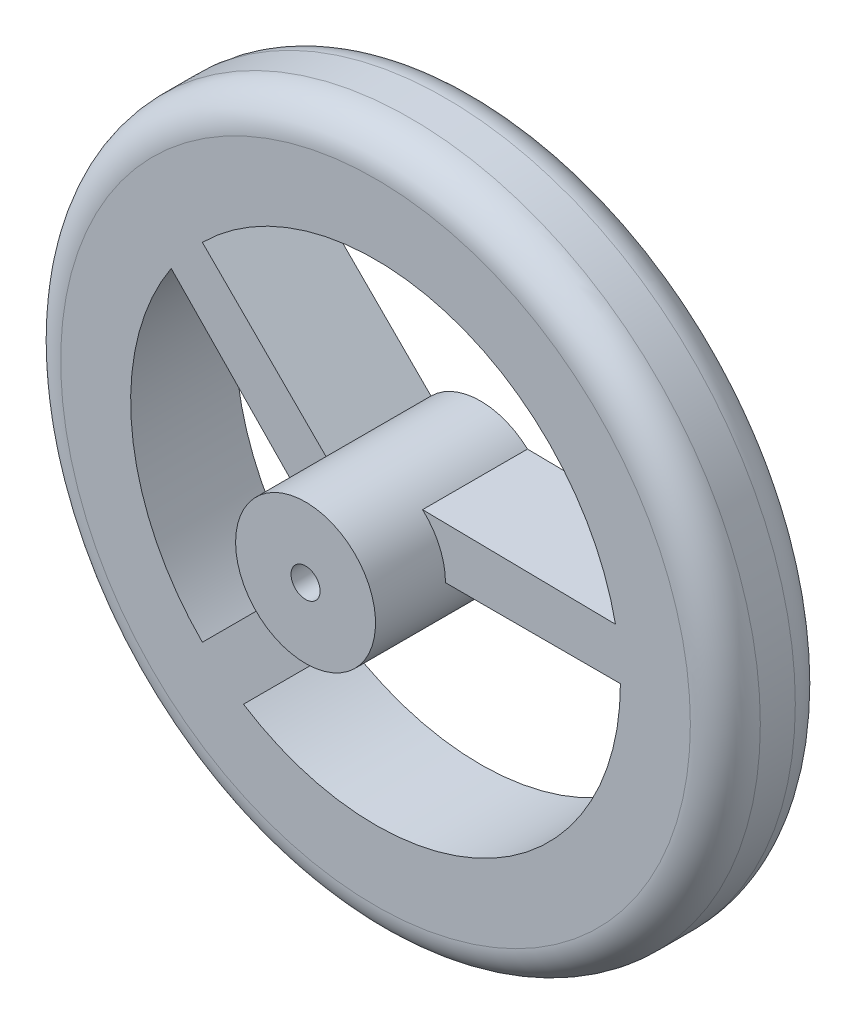
ISO-10303-21;
HEADER;
FILE_DESCRIPTION(('STEP AP214'),'2;1');
FILE_NAME('part.step','',(''),(''),'','','');
FILE_SCHEMA(('AUTOMOTIVE_DESIGN { 1 0 10303 214 1 1 1 1 }'));
ENDSEC;
DATA;
#1=APPLICATION_CONTEXT('core data for automotive mechanical design processes');
#2=APPLICATION_PROTOCOL_DEFINITION('international standard','automotive_design',2000,#1);
#3=PRODUCT_CONTEXT('',#1,'mechanical');
#4=PRODUCT('Part','Part','',(#3));
#5=PRODUCT_RELATED_PRODUCT_CATEGORY('part','',(#4));
#6=PRODUCT_DEFINITION_FORMATION('','',#4);
#7=PRODUCT_DEFINITION_CONTEXT('part definition',#1,'design');
#8=PRODUCT_DEFINITION('design','',#6,#7);
#9=PRODUCT_DEFINITION_SHAPE('','',#8);
#10=(LENGTH_UNIT() NAMED_UNIT(*) SI_UNIT(.MILLI.,.METRE.));
#11=(NAMED_UNIT(*) PLANE_ANGLE_UNIT() SI_UNIT($,.RADIAN.));
#12=(NAMED_UNIT(*) SI_UNIT($,.STERADIAN.) SOLID_ANGLE_UNIT());
#13=UNCERTAINTY_MEASURE_WITH_UNIT(LENGTH_MEASURE(1.E-05),#10,'distance_accuracy_value','');
#14=(GEOMETRIC_REPRESENTATION_CONTEXT(3) GLOBAL_UNCERTAINTY_ASSIGNED_CONTEXT((#13)) GLOBAL_UNIT_ASSIGNED_CONTEXT((#10,
#11,#12)) REPRESENTATION_CONTEXT('',''));
#15=CARTESIAN_POINT('',(0.,0.,0.));
#16=DIRECTION('',(0.,0.,1.));
#17=DIRECTION('',(1.,0.,0.));
#18=AXIS2_PLACEMENT_3D('',#15,#16,#17);
#19=CARTESIAN_POINT('',(-3.73474608254156,-3.26718277560812,20.2211248539088));
#20=DIRECTION('',(-0.71734036356114,-0.696722902455468,0.));
#21=DIRECTION('',(0.696722902455468,-0.71734036356114,0.));
#22=AXIS2_PLACEMENT_3D('',#19,#20,#21);
#23=PLANE('',#22);
#24=DIRECTION('',(0.,0.,-1.));
#25=VECTOR('',#24,1.);
#26=CARTESIAN_POINT('',(-6.50015714980125,-0.419937517281248,26.2211248539088));
#27=LINE('',#26,#25);
#28=CARTESIAN_POINT('',(-6.50015714980125,-0.419937517281248,20.2211248539088));
#29=VERTEX_POINT('',#28);
#30=CARTESIAN_POINT('',(-6.50015714980125,-0.419937517281248,11.2211248539088));
#31=VERTEX_POINT('',#30);
#32=EDGE_CURVE('E67',#29,#31,#27,.T.);
#33=ORIENTED_EDGE('',*,*,#32,.F.);
#34=DIRECTION('',(-0.696722902455468,0.71734036356114,0.));
#35=VECTOR('',#34,1.);
#36=CARTESIAN_POINT('',(-3.73474608254156,-3.26718277560812,20.2211248539088));
#37=LINE('',#36,#35);
#38=CARTESIAN_POINT('',(-18.0261327719899,11.4471153872213,20.2211248539088));
#39=VERTEX_POINT('',#38);
#40=EDGE_CURVE('E204',#29,#39,#37,.T.);
#41=ORIENTED_EDGE('',*,*,#40,.T.);
#42=DIRECTION('',(0.,0.,-1.));
#43=VECTOR('',#42,1.);
#44=CARTESIAN_POINT('',(-18.0261327719899,11.4471153872213,20.2211248539088));
#45=LINE('',#44,#43);
#46=CARTESIAN_POINT('',(-18.0261327719899,11.4471153872213,11.2211248539088));
#47=VERTEX_POINT('',#46);
#48=EDGE_CURVE('E386',#39,#47,#45,.T.);
#49=ORIENTED_EDGE('',*,*,#48,.T.);
#50=DIRECTION('',(-0.696722902455468,0.71734036356114,0.));
#51=VECTOR('',#50,1.);
#52=CARTESIAN_POINT('',(-3.73474608254156,-3.26718277560812,11.2211248539088));
#53=LINE('',#52,#51);
#54=EDGE_CURVE('E233',#31,#47,#53,.T.);
#55=ORIENTED_EDGE('',*,*,#54,.F.);
#56=EDGE_LOOP('',(#33,#41,#49,#55));
#57=FACE_BOUND('',#56,.T.);
#58=ADVANCED_FACE('F40',(#57),#23,.T.);
#59=CARTESIAN_POINT('',(-0.507057507427755,-0.132262915373639,20.2211248539088));
#60=DIRECTION('',(0.707106781186547,-0.707106781186547,0.));
#61=DIRECTION('',(0.707106781186548,0.707106781186548,0.));
#62=AXIS2_PLACEMENT_3D('',#59,#60,#61);
#63=PLANE('',#62);
#64=DIRECTION('',(-0.707106781186548,-0.707106781186548,0.));
#65=VECTOR('',#64,1.);
#66=CARTESIAN_POINT('',(-0.507057507427755,-0.132262915373639,20.2211248539088));
#67=LINE('',#66,#65);
#68=CARTESIAN_POINT('',(-4.74969819454704,-4.37490360249292,20.2211248539088));
#69=VERTEX_POINT('',#68);
#70=CARTESIAN_POINT('',(-15.3561895947211,-14.9813950026669,20.2211248539088));
#71=VERTEX_POINT('',#70);
#72=EDGE_CURVE('E44',#69,#71,#67,.T.);
#73=ORIENTED_EDGE('',*,*,#72,.F.);
#74=DIRECTION('',(0.,0.,-1.));
#75=VECTOR('',#74,1.);
#76=CARTESIAN_POINT('',(-4.74969819454704,-4.37490360249292,26.2211248539088));
#77=LINE('',#76,#75);
#78=CARTESIAN_POINT('',(-4.74969819454704,-4.37490360249292,11.2211248539088));
#79=VERTEX_POINT('',#78);
#80=EDGE_CURVE('E152',#69,#79,#77,.T.);
#81=ORIENTED_EDGE('',*,*,#80,.T.);
#82=DIRECTION('',(-0.707106781186548,-0.707106781186548,0.));
#83=VECTOR('',#82,1.);
#84=CARTESIAN_POINT('',(-0.507057507427755,-0.132262915373639,11.2211248539088));
#85=LINE('',#84,#83);
#86=CARTESIAN_POINT('',(-15.3561895947211,-14.9813950026669,11.2211248539088));
#87=VERTEX_POINT('',#86);
#88=EDGE_CURVE('E236',#79,#87,#85,.T.);
#89=ORIENTED_EDGE('',*,*,#88,.T.);
#90=CARTESIAN_POINT('',(-15.3562999123453,-14.9815053202911,20.2211248539088));
#91=DIRECTION('',(0.,0.,-1.));
#92=VECTOR('',#91,1.);
#93=LINE('',#90,#92);
#94=EDGE_CURVE('E253',#71,#87,#93,.T.);
#95=ORIENTED_EDGE('',*,*,#94,.F.);
#96=EDGE_LOOP('',(#73,#81,#89,#95));
#97=FACE_BOUND('',#96,.T.);
#98=ADVANCED_FACE('F260',(#97),#63,.F.);
#99=CARTESIAN_POINT('',(2.67492300791173,-3.31424343071308,20.2211248539088));
#100=DIRECTION('',(0.707106781186552,-0.707106781186543,0.));
#101=DIRECTION('',(0.707106781186543,0.707106781186552,0.));
#102=AXIS2_PLACEMENT_3D('',#99,#100,#101);
#103=PLANE('',#102);
#104=DIRECTION('',(0.,0.,-1.));
#105=VECTOR('',#104,1.);
#106=CARTESIAN_POINT('',(-0.131320032168712,-6.12048647079356,26.2211248539088));
#107=LINE('',#106,#105);
#108=CARTESIAN_POINT('',(-0.131320032168712,-6.12048647079356,20.2211248539088));
#109=VERTEX_POINT('',#108);
#110=CARTESIAN_POINT('',(-0.131320032168712,-6.12048647079356,11.2211248539088));
#111=VERTEX_POINT('',#110);
#112=EDGE_CURVE('E145',#109,#111,#107,.T.);
#113=ORIENTED_EDGE('',*,*,#112,.F.);
#114=DIRECTION('',(-0.707106781186543,-0.707106781186552,0.));
#115=VECTOR('',#114,1.);
#116=CARTESIAN_POINT('',(2.67492300791173,-3.31424343071308,20.2211248539088));
#117=LINE('',#116,#115);
#118=CARTESIAN_POINT('',(-11.8293866964485,-17.8185531350735,20.2211248539088));
#119=VERTEX_POINT('',#118);
#120=EDGE_CURVE('E131',#109,#119,#117,.T.);
#121=ORIENTED_EDGE('',*,*,#120,.T.);
#122=DIRECTION('',(0.,0.,-1.));
#123=VECTOR('',#122,1.);
#124=CARTESIAN_POINT('',(-11.8293866964485,-17.8185531350735,20.2211248539088));
#125=LINE('',#124,#123);
#126=CARTESIAN_POINT('',(-11.8293866964485,-17.8185531350735,11.2211248539088));
#127=VERTEX_POINT('',#126);
#128=EDGE_CURVE('E367',#119,#127,#125,.T.);
#129=ORIENTED_EDGE('',*,*,#128,.T.);
#130=DIRECTION('',(-0.707106781186543,-0.707106781186552,0.));
#131=VECTOR('',#130,1.);
#132=CARTESIAN_POINT('',(2.67492300791173,-3.31424343071308,11.2211248539088));
#133=LINE('',#132,#131);
#134=EDGE_CURVE('E147',#111,#127,#133,.T.);
#135=ORIENTED_EDGE('',*,*,#134,.F.);
#136=EDGE_LOOP('',(#113,#121,#129,#135));
#137=FACE_BOUND('',#136,.T.);
#138=ADVANCED_FACE('F146',(#137),#103,.T.);
#139=CARTESIAN_POINT('',(-0.507057507427755,-0.132262915373639,20.2211248539088));
#140=DIRECTION('',(0.,1.,0.));
#141=DIRECTION('',(0.,0.,1.));
#142=AXIS2_PLACEMENT_3D('',#139,#140,#141);
#143=PLANE('',#142);
#144=DIRECTION('',(1.,0.,0.));
#145=VECTOR('',#144,1.);
#146=CARTESIAN_POINT('',(-0.507057507427755,-0.132262915373639,20.2211248539088));
#147=LINE('',#146,#145);
#148=CARTESIAN_POINT('',(5.49294249257225,-0.132262915373639,20.2211248539088));
#149=VERTEX_POINT('',#148);
#150=CARTESIAN_POINT('',(20.4929424925722,-0.132262915373639,20.2211248539088));
#151=VERTEX_POINT('',#150);
#152=EDGE_CURVE('E141',#149,#151,#147,.T.);
#153=ORIENTED_EDGE('',*,*,#152,.F.);
#154=DIRECTION('',(0.,0.,-1.));
#155=VECTOR('',#154,1.);
#156=CARTESIAN_POINT('',(5.49294249257225,-0.132262915373639,26.2211248539088));
#157=LINE('',#156,#155);
#158=CARTESIAN_POINT('',(5.49294249257225,-0.132262915373639,11.2211248539088));
#159=VERTEX_POINT('',#158);
#160=EDGE_CURVE('E186',#149,#159,#157,.T.);
#161=ORIENTED_EDGE('',*,*,#160,.T.);
#162=DIRECTION('',(1.,0.,0.));
#163=VECTOR('',#162,1.);
#164=CARTESIAN_POINT('',(-0.507057507427755,-0.132262915373639,11.2211248539088));
#165=LINE('',#164,#163);
#166=CARTESIAN_POINT('',(20.4929424925722,-0.132262915373639,11.2211248539088));
#167=VERTEX_POINT('',#166);
#168=EDGE_CURVE('E226',#159,#167,#165,.T.);
#169=ORIENTED_EDGE('',*,*,#168,.T.);
#170=DIRECTION('',(0.,0.,-1.));
#171=VECTOR('',#170,1.);
#172=CARTESIAN_POINT('',(20.4929424925722,-0.132262915373639,20.2211248539088));
#173=LINE('',#172,#171);
#174=EDGE_CURVE('E356',#151,#167,#173,.T.);
#175=ORIENTED_EDGE('',*,*,#174,.F.);
#176=EDGE_LOOP('',(#153,#161,#169,#175));
#177=FACE_BOUND('',#176,.T.);
#178=ADVANCED_FACE('F280',(#177),#143,.F.);
#179=CARTESIAN_POINT('',(-0.441460120054603,4.36678065529586,20.2211248539088));
#180=DIRECTION('',(0.0145787465586759,0.99989372442714,0.));
#181=DIRECTION('',(-0.99989372442714,0.0145787465586759,0.));
#182=AXIS2_PLACEMENT_3D('',#179,#180,#181);
#183=PLANE('',#182);
#184=DIRECTION('',(0.,0.,-1.));
#185=VECTOR('',#184,1.);
#186=CARTESIAN_POINT('',(3.52728722823723,4.30891514385932,26.2211248539088));
#187=LINE('',#186,#185);
#188=CARTESIAN_POINT('',(3.52728722823723,4.30891514385932,20.2211248539088));
#189=VERTEX_POINT('',#188);
#190=CARTESIAN_POINT('',(3.52728722823723,4.30891514385932,11.2211248539088));
#191=VERTEX_POINT('',#190);
#192=EDGE_CURVE('E169',#189,#191,#187,.T.);
#193=ORIENTED_EDGE('',*,*,#192,.F.);
#194=DIRECTION('',(0.99989372442714,-0.0145787465586759,0.));
#195=VECTOR('',#194,1.);
#196=CARTESIAN_POINT('',(-0.441460120054603,4.36678065529586,20.2211248539088));
#197=LINE('',#196,#195);
#198=CARTESIAN_POINT('',(20.0686563319509,4.06773708462636,20.2211248539088));
#199=VERTEX_POINT('',#198);
#200=EDGE_CURVE('E190',#189,#199,#197,.T.);
#201=ORIENTED_EDGE('',*,*,#200,.T.);
#202=DIRECTION('',(0.,0.,-1.));
#203=VECTOR('',#202,1.);
#204=CARTESIAN_POINT('',(20.0686563319509,4.06773708462636,20.2211248539088));
#205=LINE('',#204,#203);
#206=CARTESIAN_POINT('',(20.0686563319509,4.06773708462636,11.2211248539088));
#207=VERTEX_POINT('',#206);
#208=EDGE_CURVE('E212',#199,#207,#205,.T.);
#209=ORIENTED_EDGE('',*,*,#208,.T.);
#210=DIRECTION('',(0.99989372442714,-0.0145787465586759,0.));
#211=VECTOR('',#210,1.);
#212=CARTESIAN_POINT('',(-0.441460120054603,4.36678065529586,11.2211248539088));
#213=LINE('',#212,#211);
#214=EDGE_CURVE('E189',#191,#207,#213,.T.);
#215=ORIENTED_EDGE('',*,*,#214,.F.);
#216=EDGE_LOOP('',(#193,#201,#209,#215));
#217=FACE_BOUND('',#216,.T.);
#218=ADVANCED_FACE('F283',(#217),#183,.T.);
#219=CARTESIAN_POINT('',(-0.507057507427755,-0.132262915373639,20.2211248539088));
#220=DIRECTION('',(-0.707106781186544,-0.707106781186551,0.));
#221=DIRECTION('',(0.707106781186551,-0.707106781186544,0.));
#222=AXIS2_PLACEMENT_3D('',#219,#220,#221);
#223=PLANE('',#222);
#224=DIRECTION('',(-0.707106781186551,0.707106781186544,0.));
#225=VECTOR('',#224,1.);
#226=CARTESIAN_POINT('',(-0.507057507427755,-0.132262915373639,20.2211248539088));
#227=LINE('',#226,#225);
#228=CARTESIAN_POINT('',(-4.74969819454706,4.11037777174562,20.2211248539088));
#229=VERTEX_POINT('',#228);
#230=CARTESIAN_POINT('',(-15.3562999123453,14.7169794895438,20.2211248539088));
#231=VERTEX_POINT('',#230);
#232=EDGE_CURVE('E193',#229,#231,#227,.T.);
#233=ORIENTED_EDGE('',*,*,#232,.F.);
#234=DIRECTION('',(0.,0.,-1.));
#235=VECTOR('',#234,1.);
#236=CARTESIAN_POINT('',(-4.74969819454706,4.11037777174562,26.2211248539088));
#237=LINE('',#236,#235);
#238=CARTESIAN_POINT('',(-4.74969819454706,4.11037777174562,11.2211248539088));
#239=VERTEX_POINT('',#238);
#240=EDGE_CURVE('E172',#229,#239,#237,.T.);
#241=ORIENTED_EDGE('',*,*,#240,.T.);
#242=DIRECTION('',(-0.707106781186551,0.707106781186544,0.));
#243=VECTOR('',#242,1.);
#244=CARTESIAN_POINT('',(-0.507057507427755,-0.132262915373639,11.2211248539088));
#245=LINE('',#244,#243);
#246=CARTESIAN_POINT('',(-15.3562999123453,14.7169794895438,11.2211248539088));
#247=VERTEX_POINT('',#246);
#248=EDGE_CURVE('E217',#239,#247,#245,.T.);
#249=ORIENTED_EDGE('',*,*,#248,.T.);
#250=DIRECTION('',(0.,0.,-1.));
#251=VECTOR('',#250,1.);
#252=CARTESIAN_POINT('',(-15.3562999123453,14.7169794895438,20.2211248539088));
#253=LINE('',#252,#251);
#254=EDGE_CURVE('E364',#231,#247,#253,.T.);
#255=ORIENTED_EDGE('',*,*,#254,.F.);
#256=EDGE_LOOP('',(#233,#241,#249,#255));
#257=FACE_BOUND('',#256,.T.);
#258=ADVANCED_FACE('F291',(#257),#223,.F.);
#259=CARTESIAN_POINT('',(-0.507057507427755,-0.132262915373639,20.2211248539088));
#260=DIRECTION('',(0.,0.,-1.));
#261=DIRECTION('',(-1.,0.,0.));
#262=AXIS2_PLACEMENT_3D('',#259,#260,#261);
#263=CYLINDRICAL_SURFACE('',#262,21.);
#264=CARTESIAN_POINT('',(-0.507057507427755,-0.132262915373639,11.2211248539088));
#265=DIRECTION('',(0.,0.,1.));
#266=DIRECTION('',(1.,0.,0.));
#267=AXIS2_PLACEMENT_3D('',#264,#265,#266);
#268=CIRCLE('',#267,21.);
#269=EDGE_CURVE('E194',#47,#87,#268,.T.);
#270=ORIENTED_EDGE('',*,*,#269,.F.);
#271=ORIENTED_EDGE('',*,*,#48,.F.);
#272=CARTESIAN_POINT('',(-0.507057507427755,-0.132262915373639,20.2211248539088));
#273=DIRECTION('',(0.,0.,1.));
#274=DIRECTION('',(1.,0.,0.));
#275=AXIS2_PLACEMENT_3D('',#272,#273,#274);
#276=CIRCLE('',#275,21.);
#277=EDGE_CURVE('E208',#39,#71,#276,.T.);
#278=ORIENTED_EDGE('',*,*,#277,.T.);
#279=ORIENTED_EDGE('',*,*,#94,.T.);
#280=EDGE_LOOP('',(#270,#271,#278,#279));
#281=FACE_BOUND('',#280,.T.);
#282=ADVANCED_FACE('F270',(#281),#263,.F.);
#283=CARTESIAN_POINT('',(-0.507057507427755,-0.132262915373639,20.2211248539088));
#284=DIRECTION('',(0.,0.,-1.));
#285=DIRECTION('',(-1.,0.,0.));
#286=AXIS2_PLACEMENT_3D('',#283,#284,#285);
#287=CYLINDRICAL_SURFACE('',#286,21.);
#288=CARTESIAN_POINT('',(-0.507057507427755,-0.132262915373639,11.2211248539088));
#289=DIRECTION('',(0.,0.,1.));
#290=DIRECTION('',(1.,0.,0.));
#291=AXIS2_PLACEMENT_3D('',#288,#289,#290);
#292=CIRCLE('',#291,21.);
#293=EDGE_CURVE('E229',#127,#167,#292,.T.);
#294=ORIENTED_EDGE('',*,*,#293,.F.);
#295=ORIENTED_EDGE('',*,*,#128,.F.);
#296=CARTESIAN_POINT('',(-0.507057507427755,-0.132262915373639,20.2211248539088));
#297=DIRECTION('',(0.,0.,1.));
#298=DIRECTION('',(1.,0.,0.));
#299=AXIS2_PLACEMENT_3D('',#296,#297,#298);
#300=CIRCLE('',#299,21.);
#301=EDGE_CURVE('E136',#119,#151,#300,.T.);
#302=ORIENTED_EDGE('',*,*,#301,.T.);
#303=ORIENTED_EDGE('',*,*,#174,.T.);
#304=EDGE_LOOP('',(#294,#295,#302,#303));
#305=FACE_BOUND('',#304,.T.);
#306=ADVANCED_FACE('F275',(#305),#287,.F.);
#307=CARTESIAN_POINT('',(-0.507057507427755,-0.132262915373639,20.2211248539088));
#308=DIRECTION('',(0.,0.,-1.));
#309=DIRECTION('',(-1.,0.,0.));
#310=AXIS2_PLACEMENT_3D('',#307,#308,#309);
#311=CYLINDRICAL_SURFACE('',#310,21.);
#312=CARTESIAN_POINT('',(-0.507057507427755,-0.132262915373639,11.2211248539088));
#313=DIRECTION('',(0.,0.,1.));
#314=DIRECTION('',(1.,0.,0.));
#315=AXIS2_PLACEMENT_3D('',#312,#313,#314);
#316=CIRCLE('',#315,21.);
#317=EDGE_CURVE('E220',#207,#247,#316,.T.);
#318=ORIENTED_EDGE('',*,*,#317,.F.);
#319=ORIENTED_EDGE('',*,*,#208,.F.);
#320=CARTESIAN_POINT('',(-0.507057507427755,-0.132262915373639,20.2211248539088));
#321=DIRECTION('',(0.,0.,1.));
#322=DIRECTION('',(1.,0.,0.));
#323=AXIS2_PLACEMENT_3D('',#320,#321,#322);
#324=CIRCLE('',#323,21.);
#325=EDGE_CURVE('E142',#199,#231,#324,.T.);
#326=ORIENTED_EDGE('',*,*,#325,.T.);
#327=ORIENTED_EDGE('',*,*,#254,.T.);
#328=EDGE_LOOP('',(#318,#319,#326,#327));
#329=FACE_BOUND('',#328,.T.);
#330=ADVANCED_FACE('F278',(#329),#311,.F.);
#331=CARTESIAN_POINT('',(-0.507057507427755,-0.132262915373639,20.2211248539088));
#332=DIRECTION('',(0.,0.,-1.));
#333=DIRECTION('',(-1.,0.,0.));
#334=AXIS2_PLACEMENT_3D('',#331,#332,#333);
#335=CYLINDRICAL_SURFACE('',#334,30.);
#336=CARTESIAN_POINT('',(-0.507057507427755,-0.132262915373639,17.2211248539088));
#337=DIRECTION('',(0.,0.,1.));
#338=DIRECTION('',(1.,0.,0.));
#339=AXIS2_PLACEMENT_3D('',#336,#337,#338);
#340=CIRCLE('',#339,30.);
#341=CARTESIAN_POINT('',(29.4929424925723,-0.132262915373639,17.2211248539088));
#342=VERTEX_POINT('',#341);
#343=EDGE_CURVE('E51',#342,#342,#340,.F.);
#344=ORIENTED_EDGE('',*,*,#343,.T.);
#345=EDGE_LOOP('',(#344));
#346=FACE_BOUND('',#345,.T.);
#347=CARTESIAN_POINT('',(-0.507057507427755,-0.132262915373639,14.2211248539088));
#348=DIRECTION('',(0.,0.,1.));
#349=DIRECTION('',(1.,0.,0.));
#350=AXIS2_PLACEMENT_3D('',#347,#348,#349);
#351=CIRCLE('',#350,30.);
#352=CARTESIAN_POINT('',(29.4929424925723,-0.132262915373639,14.2211248539088));
#353=VERTEX_POINT('',#352);
#354=EDGE_CURVE('E245',#353,#353,#351,.T.);
#355=ORIENTED_EDGE('',*,*,#354,.T.);
#356=EDGE_LOOP('',(#355));
#357=FACE_BOUND('',#356,.T.);
#358=ADVANCED_FACE('F289',(#346,#357),#335,.T.);
#359=CARTESIAN_POINT('',(-0.507057507427755,-0.132262915373639,20.2211248539088));
#360=DIRECTION('',(0.,0.,1.));
#361=DIRECTION('',(1.,0.,0.));
#362=AXIS2_PLACEMENT_3D('',#359,#360,#361);
#363=PLANE('',#362);
#364=CARTESIAN_POINT('',(-0.507057507427755,-0.132262915373639,20.2211248539088));
#365=DIRECTION('',(0.,0.,1.));
#366=DIRECTION('',(1.,0.,0.));
#367=AXIS2_PLACEMENT_3D('',#364,#365,#366);
#368=CIRCLE('',#367,6.);
#369=EDGE_CURVE('E161',#149,#189,#368,.T.);
#370=ORIENTED_EDGE('',*,*,#369,.F.);
#371=ORIENTED_EDGE('',*,*,#152,.T.);
#372=ORIENTED_EDGE('',*,*,#301,.F.);
#373=ORIENTED_EDGE('',*,*,#120,.F.);
#374=EDGE_CURVE('E59',#69,#109,#368,.T.);
#375=ORIENTED_EDGE('',*,*,#374,.F.);
#376=ORIENTED_EDGE('',*,*,#72,.T.);
#377=ORIENTED_EDGE('',*,*,#277,.F.);
#378=ORIENTED_EDGE('',*,*,#40,.F.);
#379=EDGE_CURVE('E162',#229,#29,#368,.T.);
#380=ORIENTED_EDGE('',*,*,#379,.F.);
#381=ORIENTED_EDGE('',*,*,#232,.T.);
#382=ORIENTED_EDGE('',*,*,#325,.F.);
#383=ORIENTED_EDGE('',*,*,#200,.F.);
#384=EDGE_LOOP('',(#370,#371,#372,#373,#375,#376,#377,#378,#380,#381,#382,#383));
#385=FACE_BOUND('',#384,.T.);
#386=CARTESIAN_POINT('',(-0.507057507427755,-0.132262915373639,20.2211248539088));
#387=DIRECTION('',(0.,0.,1.));
#388=DIRECTION('',(1.,0.,0.));
#389=AXIS2_PLACEMENT_3D('',#386,#387,#388);
#390=CIRCLE('',#389,27.);
#391=CARTESIAN_POINT('',(26.4929424925722,-0.132262915373639,20.2211248539088));
#392=VERTEX_POINT('',#391);
#393=EDGE_CURVE('E249',#392,#392,#390,.T.);
#394=ORIENTED_EDGE('',*,*,#393,.T.);
#395=EDGE_LOOP('',(#394));
#396=FACE_BOUND('',#395,.T.);
#397=ADVANCED_FACE('F133',(#385,#396),#363,.T.);
#398=CARTESIAN_POINT('',(-0.507057507427755,-0.132262915373639,11.2211248539088));
#399=DIRECTION('',(0.,0.,1.));
#400=DIRECTION('',(1.,0.,0.));
#401=AXIS2_PLACEMENT_3D('',#398,#399,#400);
#402=PLANE('',#401);
#403=CARTESIAN_POINT('',(-0.507057507427755,-0.132262915373639,11.2211248539088));
#404=DIRECTION('',(0.,0.,-1.));
#405=DIRECTION('',(-1.,0.,0.));
#406=AXIS2_PLACEMENT_3D('',#403,#404,#405);
#407=CIRCLE('',#406,6.);
#408=EDGE_CURVE('E335',#79,#31,#407,.T.);
#409=ORIENTED_EDGE('',*,*,#408,.T.);
#410=ORIENTED_EDGE('',*,*,#54,.T.);
#411=ORIENTED_EDGE('',*,*,#269,.T.);
#412=ORIENTED_EDGE('',*,*,#88,.F.);
#413=EDGE_LOOP('',(#409,#410,#411,#412));
#414=FACE_BOUND('',#413,.T.);
#415=EDGE_CURVE('E339',#159,#111,#407,.T.);
#416=ORIENTED_EDGE('',*,*,#415,.T.);
#417=ORIENTED_EDGE('',*,*,#134,.T.);
#418=ORIENTED_EDGE('',*,*,#293,.T.);
#419=ORIENTED_EDGE('',*,*,#168,.F.);
#420=EDGE_LOOP('',(#416,#417,#418,#419));
#421=FACE_BOUND('',#420,.T.);
#422=EDGE_CURVE('E341',#239,#191,#407,.T.);
#423=ORIENTED_EDGE('',*,*,#422,.T.);
#424=ORIENTED_EDGE('',*,*,#214,.T.);
#425=ORIENTED_EDGE('',*,*,#317,.T.);
#426=ORIENTED_EDGE('',*,*,#248,.F.);
#427=EDGE_LOOP('',(#423,#424,#425,#426));
#428=FACE_BOUND('',#427,.T.);
#429=CARTESIAN_POINT('',(-0.507057507427755,-0.132262915373639,11.2211248539088));
#430=DIRECTION('',(0.,0.,1.));
#431=DIRECTION('',(1.,0.,0.));
#432=AXIS2_PLACEMENT_3D('',#429,#430,#431);
#433=CIRCLE('',#432,27.);
#434=CARTESIAN_POINT('',(26.4929424925722,-0.132262915373639,11.2211248539088));
#435=VERTEX_POINT('',#434);
#436=EDGE_CURVE('E11',#435,#435,#433,.F.);
#437=ORIENTED_EDGE('',*,*,#436,.T.);
#438=EDGE_LOOP('',(#437));
#439=FACE_BOUND('',#438,.T.);
#440=ADVANCED_FACE('F299',(#414,#421,#428,#439),#402,.F.);
#441=CARTESIAN_POINT('',(-0.507057507427755,-0.132262915373639,17.2211248539088));
#442=DIRECTION('',(0.,0.,1.));
#443=DIRECTION('',(1.,0.,0.));
#444=AXIS2_PLACEMENT_3D('',#441,#442,#443);
#445=TOROIDAL_SURFACE('',#444,27.,3.);
#446=ORIENTED_EDGE('',*,*,#343,.F.);
#447=EDGE_LOOP('',(#446));
#448=FACE_BOUND('',#447,.T.);
#449=ORIENTED_EDGE('',*,*,#393,.F.);
#450=EDGE_LOOP('',(#449));
#451=FACE_BOUND('',#450,.T.);
#452=ADVANCED_FACE('F297',(#448,#451),#445,.T.);
#453=CARTESIAN_POINT('',(-0.507057507427755,-0.132262915373639,14.2211248539088));
#454=DIRECTION('',(0.,0.,1.));
#455=DIRECTION('',(1.,0.,0.));
#456=AXIS2_PLACEMENT_3D('',#453,#454,#455);
#457=TOROIDAL_SURFACE('',#456,27.,3.);
#458=ORIENTED_EDGE('',*,*,#436,.F.);
#459=EDGE_LOOP('',(#458));
#460=FACE_BOUND('',#459,.T.);
#461=ORIENTED_EDGE('',*,*,#354,.F.);
#462=EDGE_LOOP('',(#461));
#463=FACE_BOUND('',#462,.T.);
#464=ADVANCED_FACE('F42',(#460,#463),#457,.T.);
#465=CARTESIAN_POINT('',(-0.507057507427755,-0.132262915373639,26.2211248539088));
#466=DIRECTION('',(0.,0.,-1.));
#467=DIRECTION('',(-1.,0.,0.));
#468=AXIS2_PLACEMENT_3D('',#465,#466,#467);
#469=CYLINDRICAL_SURFACE('',#468,6.);
#470=CARTESIAN_POINT('',(-0.507057507427755,-0.132262915373639,26.2211248539088));
#471=DIRECTION('',(0.,0.,-1.));
#472=DIRECTION('',(-1.,0.,0.));
#473=AXIS2_PLACEMENT_3D('',#470,#471,#472);
#474=CIRCLE('',#473,6.);
#475=CARTESIAN_POINT('',(-6.50705750742776,-0.132262915373639,26.2211248539088));
#476=VERTEX_POINT('',#475);
#477=EDGE_CURVE('E165',#476,#476,#474,.T.);
#478=ORIENTED_EDGE('',*,*,#477,.T.);
#479=EDGE_LOOP('',(#478));
#480=FACE_BOUND('',#479,.T.);
#481=ORIENTED_EDGE('',*,*,#160,.F.);
#482=ORIENTED_EDGE('',*,*,#369,.T.);
#483=ORIENTED_EDGE('',*,*,#192,.T.);
#484=ORIENTED_EDGE('',*,*,#422,.F.);
#485=ORIENTED_EDGE('',*,*,#240,.F.);
#486=ORIENTED_EDGE('',*,*,#379,.T.);
#487=ORIENTED_EDGE('',*,*,#32,.T.);
#488=ORIENTED_EDGE('',*,*,#408,.F.);
#489=ORIENTED_EDGE('',*,*,#80,.F.);
#490=ORIENTED_EDGE('',*,*,#374,.T.);
#491=ORIENTED_EDGE('',*,*,#112,.T.);
#492=ORIENTED_EDGE('',*,*,#415,.F.);
#493=EDGE_LOOP('',(#481,#482,#483,#484,#485,#486,#487,#488,#489,#490,#491,#492));
#494=FACE_BOUND('',#493,.T.);
#495=ADVANCED_FACE('F156',(#480,#494),#469,.T.);
#496=CARTESIAN_POINT('',(-0.507057507427755,-0.132262915373639,26.2211248539088));
#497=DIRECTION('',(0.,0.,-1.));
#498=DIRECTION('',(-1.,0.,0.));
#499=AXIS2_PLACEMENT_3D('',#496,#497,#498);
#500=PLANE('',#499);
#501=CARTESIAN_POINT('',(-0.507057507427755,-0.132262915373639,26.2211248539088));
#502=DIRECTION('',(0.,0.,-1.));
#503=DIRECTION('',(-1.,0.,0.));
#504=AXIS2_PLACEMENT_3D('',#501,#502,#503);
#505=CIRCLE('',#504,1.245);
#506=CARTESIAN_POINT('',(-1.75205750742776,-0.132262915373639,26.2211248539088));
#507=VERTEX_POINT('',#506);
#508=EDGE_CURVE('E332',#507,#507,#505,.T.);
#509=ORIENTED_EDGE('',*,*,#508,.T.);
#510=EDGE_LOOP('',(#509));
#511=FACE_BOUND('',#510,.T.);
#512=ORIENTED_EDGE('',*,*,#477,.F.);
#513=EDGE_LOOP('',(#512));
#514=FACE_BOUND('',#513,.T.);
#515=ADVANCED_FACE('F325',(#511,#514),#500,.F.);
#516=CARTESIAN_POINT('',(-0.507057507427755,-0.132262915373639,26.2211248539088));
#517=DIRECTION('',(0.,0.,-1.));
#518=DIRECTION('',(-1.,0.,0.));
#519=AXIS2_PLACEMENT_3D('',#516,#517,#518);
#520=CYLINDRICAL_SURFACE('',#519,1.245);
#521=CARTESIAN_POINT('',(-0.507057507427755,-0.132262915373639,20.2211248539088));
#522=DIRECTION('',(0.,0.,1.));
#523=DIRECTION('',(1.,0.,0.));
#524=AXIS2_PLACEMENT_3D('',#521,#522,#523);
#525=CIRCLE('',#524,1.245);
#526=CARTESIAN_POINT('',(0.737942492572245,-0.132262915373639,20.2211248539088));
#527=VERTEX_POINT('',#526);
#528=EDGE_CURVE('E159',#527,#527,#525,.T.);
#529=ORIENTED_EDGE('',*,*,#528,.F.);
#530=EDGE_LOOP('',(#529));
#531=FACE_BOUND('',#530,.T.);
#532=ORIENTED_EDGE('',*,*,#508,.F.);
#533=EDGE_LOOP('',(#532));
#534=FACE_BOUND('',#533,.T.);
#535=ADVANCED_FACE('F320',(#531,#534),#520,.F.);
#536=ORIENTED_EDGE('',*,*,#528,.T.);
#537=EDGE_LOOP('',(#536));
#538=FACE_BOUND('',#537,.T.);
#539=ADVANCED_FACE('F313',(#538),#363,.T.);
#540=CLOSED_SHELL('',(#58,#98,#138,#178,#218,#258,#282,#306,#330,#358,#397,#440,#452,#464,#495,
#515,#535,#539));
#541=MANIFOLD_SOLID_BREP('B2',#540);
#542=ADVANCED_BREP_SHAPE_REPRESENTATION('',(#18,#541),#14);
#543=SHAPE_DEFINITION_REPRESENTATION(#9,#542);
ENDSEC;
END-ISO-10303-21;
